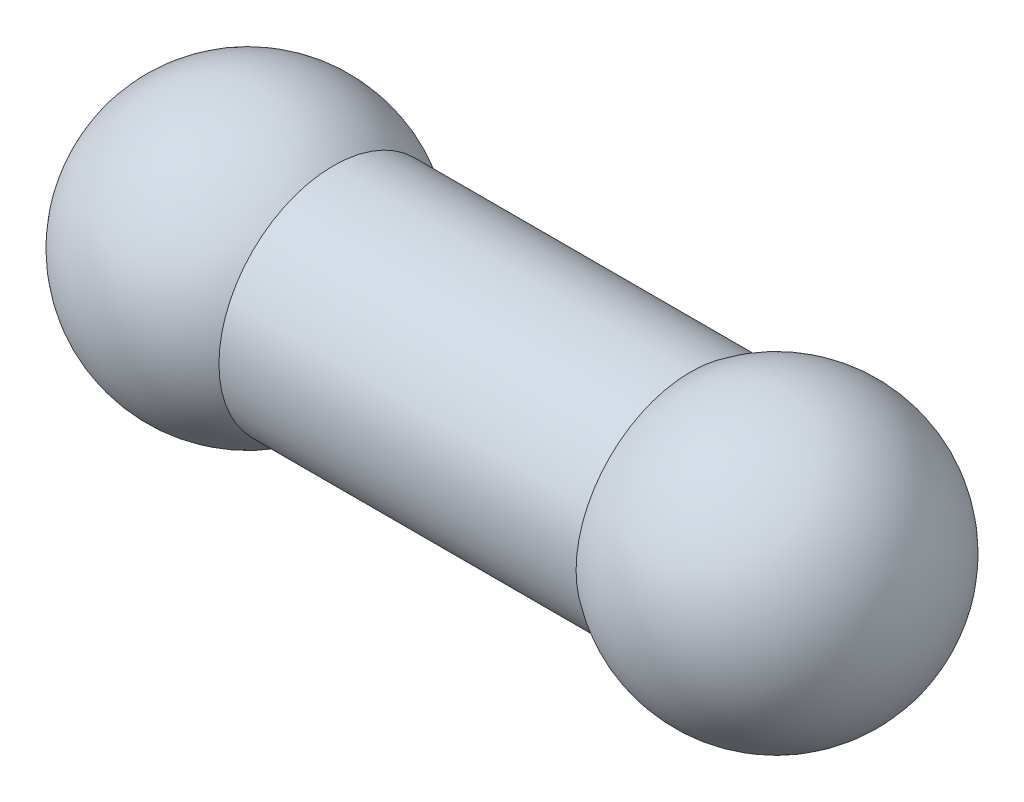
ISO-10303-21;
HEADER;
FILE_DESCRIPTION(('STEP AP214'),'2;1');
FILE_NAME('part.step','',(''),(''),'','','');
FILE_SCHEMA(('AUTOMOTIVE_DESIGN { 1 0 10303 214 1 1 1 1 }'));
ENDSEC;
DATA;
#1=APPLICATION_CONTEXT('core data for automotive mechanical design processes');
#2=APPLICATION_PROTOCOL_DEFINITION('international standard','automotive_design',2000,#1);
#3=PRODUCT_CONTEXT('',#1,'mechanical');
#4=PRODUCT('Part','Part','',(#3));
#5=PRODUCT_RELATED_PRODUCT_CATEGORY('part','',(#4));
#6=PRODUCT_DEFINITION_FORMATION('','',#4);
#7=PRODUCT_DEFINITION_CONTEXT('part definition',#1,'design');
#8=PRODUCT_DEFINITION('design','',#6,#7);
#9=PRODUCT_DEFINITION_SHAPE('','',#8);
#10=(LENGTH_UNIT() NAMED_UNIT(*) SI_UNIT(.MILLI.,.METRE.));
#11=(NAMED_UNIT(*) PLANE_ANGLE_UNIT() SI_UNIT($,.RADIAN.));
#12=(NAMED_UNIT(*) SI_UNIT($,.STERADIAN.) SOLID_ANGLE_UNIT());
#13=UNCERTAINTY_MEASURE_WITH_UNIT(LENGTH_MEASURE(1.E-05),#10,'distance_accuracy_value','');
#14=(GEOMETRIC_REPRESENTATION_CONTEXT(3) GLOBAL_UNCERTAINTY_ASSIGNED_CONTEXT((#13)) GLOBAL_UNIT_ASSIGNED_CONTEXT((#10,
#11,#12)) REPRESENTATION_CONTEXT('',''));
#15=CARTESIAN_POINT('',(0.,0.,0.));
#16=DIRECTION('',(0.,0.,1.));
#17=DIRECTION('',(1.,0.,0.));
#18=AXIS2_PLACEMENT_3D('',#15,#16,#17);
#19=CARTESIAN_POINT('',(-22.4134270819153,0.,0.));
#20=DIRECTION('',(-1.,0.,0.));
#21=DIRECTION('',(0.,1.,0.));
#22=AXIS2_PLACEMENT_3D('',#19,#20,#21);
#23=SPHERICAL_SURFACE('',#22,6.);
#24=CARTESIAN_POINT('',(-18.82455539293,0.,0.));
#25=DIRECTION('',(-1.,0.,0.));
#26=DIRECTION('',(0.,0.,1.));
#27=AXIS2_PLACEMENT_3D('',#24,#25,#26);
#28=CIRCLE('',#27,4.8083261120685);
#29=CARTESIAN_POINT('',(-18.82455539293,0.,4.8083261120685));
#30=VERTEX_POINT('',#29);
#31=EDGE_CURVE('E41',#30,#30,#28,.T.);
#32=ORIENTED_EDGE('',*,*,#31,.T.);
#33=EDGE_LOOP('',(#32));
#34=FACE_BOUND('',#33,.T.);
#35=ADVANCED_FACE('F35',(#34),#23,.T.);
#36=CARTESIAN_POINT('',(-0.23568370394465,0.,0.));
#37=DIRECTION('',(-1.,0.,0.));
#38=DIRECTION('',(0.,1.,0.));
#39=AXIS2_PLACEMENT_3D('',#36,#37,#38);
#40=SPHERICAL_SURFACE('',#39,6.);
#41=CARTESIAN_POINT('',(-3.82455539292995,0.,0.));
#42=DIRECTION('',(-1.,0.,0.));
#43=DIRECTION('',(0.,0.,1.));
#44=AXIS2_PLACEMENT_3D('',#41,#42,#43);
#45=CIRCLE('',#44,4.8083261120685);
#46=CARTESIAN_POINT('',(-3.82455539292995,0.,4.8083261120685));
#47=VERTEX_POINT('',#46);
#48=EDGE_CURVE('E10',#47,#47,#45,.T.);
#49=ORIENTED_EDGE('',*,*,#48,.F.);
#50=EDGE_LOOP('',(#49));
#51=FACE_BOUND('',#50,.T.);
#52=ADVANCED_FACE('F50',(#51),#40,.T.);
#53=CARTESIAN_POINT('',(-28.4134270819153,0.,0.));
#54=DIRECTION('',(-1.,0.,0.));
#55=DIRECTION('',(0.,0.,1.));
#56=AXIS2_PLACEMENT_3D('',#53,#54,#55);
#57=CYLINDRICAL_SURFACE('',#56,4.8083261120685);
#58=ORIENTED_EDGE('',*,*,#31,.F.);
#59=EDGE_LOOP('',(#58));
#60=FACE_BOUND('',#59,.T.);
#61=ORIENTED_EDGE('',*,*,#48,.T.);
#62=EDGE_LOOP('',(#61));
#63=FACE_BOUND('',#62,.T.);
#64=ADVANCED_FACE('F48',(#60,#63),#57,.T.);
#65=CLOSED_SHELL('',(#35,#52,#64));
#66=MANIFOLD_SOLID_BREP('B2',#65);
#67=ADVANCED_BREP_SHAPE_REPRESENTATION('',(#18,#66),#14);
#68=SHAPE_DEFINITION_REPRESENTATION(#9,#67);
ENDSEC;
END-ISO-10303-21;
